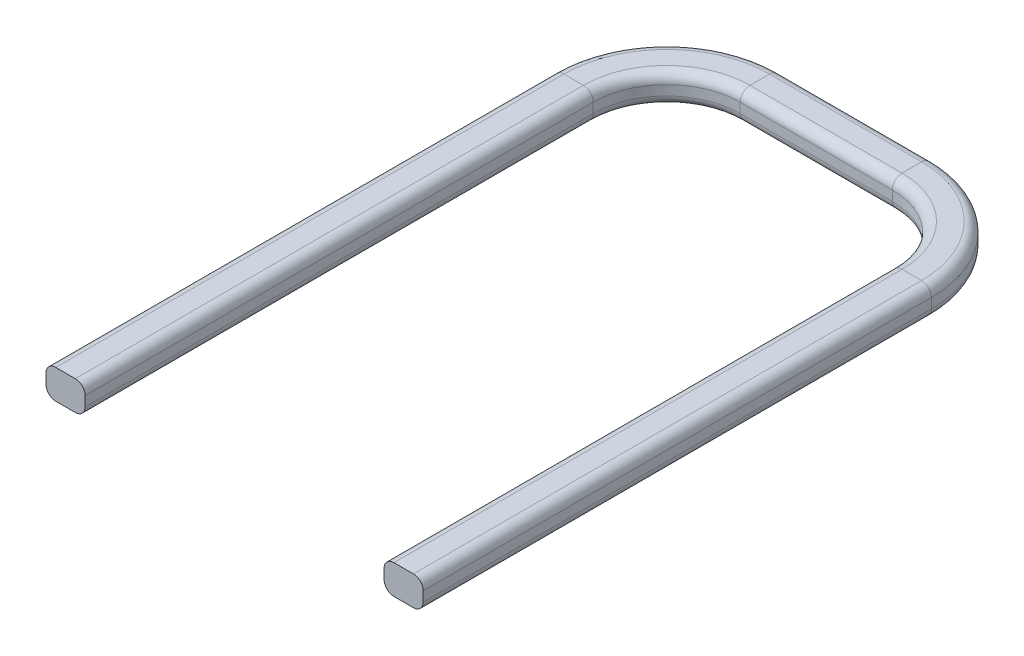
ISO-10303-21;
HEADER;
FILE_DESCRIPTION(('STEP AP214'),'2;1');
FILE_NAME('part.step','',(''),(''),'','','');
FILE_SCHEMA(('AUTOMOTIVE_DESIGN { 1 0 10303 214 1 1 1 1 }'));
ENDSEC;
DATA;
#1=APPLICATION_CONTEXT('core data for automotive mechanical design processes');
#2=APPLICATION_PROTOCOL_DEFINITION('international standard','automotive_design',2000,#1);
#3=PRODUCT_CONTEXT('',#1,'mechanical');
#4=PRODUCT('Part','Part','',(#3));
#5=PRODUCT_RELATED_PRODUCT_CATEGORY('part','',(#4));
#6=PRODUCT_DEFINITION_FORMATION('','',#4);
#7=PRODUCT_DEFINITION_CONTEXT('part definition',#1,'design');
#8=PRODUCT_DEFINITION('design','',#6,#7);
#9=PRODUCT_DEFINITION_SHAPE('','',#8);
#10=(LENGTH_UNIT() NAMED_UNIT(*) SI_UNIT(.MILLI.,.METRE.));
#11=(NAMED_UNIT(*) PLANE_ANGLE_UNIT() SI_UNIT($,.RADIAN.));
#12=(NAMED_UNIT(*) SI_UNIT($,.STERADIAN.) SOLID_ANGLE_UNIT());
#13=UNCERTAINTY_MEASURE_WITH_UNIT(LENGTH_MEASURE(1.E-05),#10,'distance_accuracy_value','');
#14=(GEOMETRIC_REPRESENTATION_CONTEXT(3) GLOBAL_UNCERTAINTY_ASSIGNED_CONTEXT((#13)) GLOBAL_UNIT_ASSIGNED_CONTEXT((#10,
#11,#12)) REPRESENTATION_CONTEXT('',''));
#15=CARTESIAN_POINT('',(0.,0.,0.));
#16=DIRECTION('',(0.,0.,1.));
#17=DIRECTION('',(1.,0.,0.));
#18=AXIS2_PLACEMENT_3D('',#15,#16,#17);
#19=CARTESIAN_POINT('',(0.,0.,0.));
#20=DIRECTION('',(0.,0.,1.));
#21=DIRECTION('',(1.,0.,0.));
#22=AXIS2_PLACEMENT_3D('',#19,#20,#21);
#23=PLANE('',#22);
#24=DIRECTION('',(1.,0.,0.));
#25=VECTOR('',#24,1.);
#26=CARTESIAN_POINT('',(-0.5,-0.375,0.));
#27=LINE('',#26,#25);
#28=CARTESIAN_POINT('',(-0.25,-0.375,0.));
#29=VERTEX_POINT('',#28);
#30=CARTESIAN_POINT('',(0.25,-0.375,0.));
#31=VERTEX_POINT('',#30);
#32=EDGE_CURVE('E390',#29,#31,#27,.T.);
#33=ORIENTED_EDGE('',*,*,#32,.T.);
#34=CARTESIAN_POINT('',(0.25,-0.125,0.));
#35=DIRECTION('',(0.,0.,1.));
#36=DIRECTION('',(1.,0.,0.));
#37=AXIS2_PLACEMENT_3D('',#34,#35,#36);
#38=CIRCLE('',#37,0.25);
#39=CARTESIAN_POINT('',(0.5,-0.125,0.));
#40=VERTEX_POINT('',#39);
#41=EDGE_CURVE('E319',#31,#40,#38,.T.);
#42=ORIENTED_EDGE('',*,*,#41,.T.);
#43=DIRECTION('',(0.,1.,0.));
#44=VECTOR('',#43,1.);
#45=CARTESIAN_POINT('',(0.5,0.375,0.));
#46=LINE('',#45,#44);
#47=CARTESIAN_POINT('',(0.5,0.125,0.));
#48=VERTEX_POINT('',#47);
#49=EDGE_CURVE('E382',#40,#48,#46,.T.);
#50=ORIENTED_EDGE('',*,*,#49,.T.);
#51=CARTESIAN_POINT('',(0.25,0.125,0.));
#52=DIRECTION('',(0.,0.,1.));
#53=DIRECTION('',(1.,0.,0.));
#54=AXIS2_PLACEMENT_3D('',#51,#52,#53);
#55=CIRCLE('',#54,0.25);
#56=CARTESIAN_POINT('',(0.25,0.375,0.));
#57=VERTEX_POINT('',#56);
#58=EDGE_CURVE('E314',#48,#57,#55,.T.);
#59=ORIENTED_EDGE('',*,*,#58,.T.);
#60=DIRECTION('',(-1.,0.,0.));
#61=VECTOR('',#60,1.);
#62=CARTESIAN_POINT('',(-0.5,0.375,0.));
#63=LINE('',#62,#61);
#64=CARTESIAN_POINT('',(-0.25,0.375,0.));
#65=VERTEX_POINT('',#64);
#66=EDGE_CURVE('E389',#57,#65,#63,.T.);
#67=ORIENTED_EDGE('',*,*,#66,.T.);
#68=CARTESIAN_POINT('',(-0.25,0.125,0.));
#69=DIRECTION('',(0.,0.,1.));
#70=DIRECTION('',(1.,0.,0.));
#71=AXIS2_PLACEMENT_3D('',#68,#69,#70);
#72=CIRCLE('',#71,0.25);
#73=CARTESIAN_POINT('',(-0.5,0.125,0.));
#74=VERTEX_POINT('',#73);
#75=EDGE_CURVE('E57',#65,#74,#72,.T.);
#76=ORIENTED_EDGE('',*,*,#75,.T.);
#77=DIRECTION('',(0.,-1.,0.));
#78=VECTOR('',#77,1.);
#79=CARTESIAN_POINT('',(-0.5,0.375,0.));
#80=LINE('',#79,#78);
#81=CARTESIAN_POINT('',(-0.5,-0.125,0.));
#82=VERTEX_POINT('',#81);
#83=EDGE_CURVE('E332',#74,#82,#80,.T.);
#84=ORIENTED_EDGE('',*,*,#83,.T.);
#85=CARTESIAN_POINT('',(-0.25,-0.125,0.));
#86=DIRECTION('',(0.,0.,1.));
#87=DIRECTION('',(1.,0.,0.));
#88=AXIS2_PLACEMENT_3D('',#85,#86,#87);
#89=CIRCLE('',#88,0.25);
#90=EDGE_CURVE('E317',#82,#29,#89,.T.);
#91=ORIENTED_EDGE('',*,*,#90,.T.);
#92=EDGE_LOOP('',(#33,#42,#50,#59,#67,#76,#84,#91));
#93=FACE_BOUND('',#92,.T.);
#94=ADVANCED_FACE('F33',(#93),#23,.T.);
#95=CARTESIAN_POINT('',(8.65,0.,0.));
#96=DIRECTION('',(0.,0.,-1.));
#97=DIRECTION('',(-1.,0.,0.));
#98=AXIS2_PLACEMENT_3D('',#95,#96,#97);
#99=PLANE('',#98);
#100=DIRECTION('',(0.,1.,0.));
#101=VECTOR('',#100,1.);
#102=CARTESIAN_POINT('',(8.15,0.375,0.));
#103=LINE('',#102,#101);
#104=CARTESIAN_POINT('',(8.15,-0.125,0.));
#105=VERTEX_POINT('',#104);
#106=CARTESIAN_POINT('',(8.15,0.125,0.));
#107=VERTEX_POINT('',#106);
#108=EDGE_CURVE('E410',#105,#107,#103,.T.);
#109=ORIENTED_EDGE('',*,*,#108,.F.);
#110=CARTESIAN_POINT('',(8.4,-0.125,0.));
#111=DIRECTION('',(0.,0.,-1.));
#112=DIRECTION('',(-1.,0.,0.));
#113=AXIS2_PLACEMENT_3D('',#110,#111,#112);
#114=CIRCLE('',#113,0.25);
#115=CARTESIAN_POINT('',(8.4,-0.375,0.));
#116=VERTEX_POINT('',#115);
#117=EDGE_CURVE('E235',#105,#116,#114,.F.);
#118=ORIENTED_EDGE('',*,*,#117,.T.);
#119=DIRECTION('',(-1.,0.,0.));
#120=VECTOR('',#119,1.);
#121=CARTESIAN_POINT('',(9.15,-0.375,0.));
#122=LINE('',#121,#120);
#123=CARTESIAN_POINT('',(8.9,-0.375,0.));
#124=VERTEX_POINT('',#123);
#125=EDGE_CURVE('E397',#124,#116,#122,.T.);
#126=ORIENTED_EDGE('',*,*,#125,.F.);
#127=CARTESIAN_POINT('',(8.9,-0.125,0.));
#128=DIRECTION('',(0.,0.,-1.));
#129=DIRECTION('',(-1.,0.,0.));
#130=AXIS2_PLACEMENT_3D('',#127,#128,#129);
#131=CIRCLE('',#130,0.25);
#132=CARTESIAN_POINT('',(9.15,-0.125,0.));
#133=VERTEX_POINT('',#132);
#134=EDGE_CURVE('E245',#124,#133,#131,.F.);
#135=ORIENTED_EDGE('',*,*,#134,.T.);
#136=DIRECTION('',(0.,-1.,0.));
#137=VECTOR('',#136,1.);
#138=CARTESIAN_POINT('',(9.15,0.375,0.));
#139=LINE('',#138,#137);
#140=CARTESIAN_POINT('',(9.15,0.125,0.));
#141=VERTEX_POINT('',#140);
#142=EDGE_CURVE('E422',#141,#133,#139,.T.);
#143=ORIENTED_EDGE('',*,*,#142,.F.);
#144=CARTESIAN_POINT('',(8.9,0.125,0.));
#145=DIRECTION('',(0.,0.,-1.));
#146=DIRECTION('',(-1.,0.,0.));
#147=AXIS2_PLACEMENT_3D('',#144,#145,#146);
#148=CIRCLE('',#147,0.25);
#149=CARTESIAN_POINT('',(8.9,0.375,0.));
#150=VERTEX_POINT('',#149);
#151=EDGE_CURVE('E238',#141,#150,#148,.F.);
#152=ORIENTED_EDGE('',*,*,#151,.T.);
#153=DIRECTION('',(1.,0.,0.));
#154=VECTOR('',#153,1.);
#155=CARTESIAN_POINT('',(9.15,0.375,0.));
#156=LINE('',#155,#154);
#157=CARTESIAN_POINT('',(8.4,0.375,0.));
#158=VERTEX_POINT('',#157);
#159=EDGE_CURVE('E240',#158,#150,#156,.T.);
#160=ORIENTED_EDGE('',*,*,#159,.F.);
#161=CARTESIAN_POINT('',(8.4,0.125,0.));
#162=DIRECTION('',(0.,0.,-1.));
#163=DIRECTION('',(-1.,0.,0.));
#164=AXIS2_PLACEMENT_3D('',#161,#162,#163);
#165=CIRCLE('',#164,0.25);
#166=EDGE_CURVE('E236',#158,#107,#165,.F.);
#167=ORIENTED_EDGE('',*,*,#166,.T.);
#168=EDGE_LOOP('',(#109,#118,#126,#135,#143,#152,#160,#167));
#169=FACE_BOUND('',#168,.T.);
#170=ADVANCED_FACE('F507',(#169),#99,.F.);
#171=CARTESIAN_POINT('',(-0.5,0.375,0.));
#172=DIRECTION('',(1.,0.,0.));
#173=DIRECTION('',(0.,1.,0.));
#174=AXIS2_PLACEMENT_3D('',#171,#172,#173);
#175=PLANE('',#174);
#176=DIRECTION('',(0.,-1.,0.));
#177=VECTOR('',#176,1.);
#178=CARTESIAN_POINT('',(-0.5,0.375,-13.));
#179=LINE('',#178,#177);
#180=CARTESIAN_POINT('',(-0.5,0.125,-13.));
#181=VERTEX_POINT('',#180);
#182=CARTESIAN_POINT('',(-0.5,-0.125,-13.));
#183=VERTEX_POINT('',#182);
#184=EDGE_CURVE('E392',#181,#183,#179,.T.);
#185=ORIENTED_EDGE('',*,*,#184,.T.);
#186=DIRECTION('',(0.,0.,-1.));
#187=VECTOR('',#186,1.);
#188=CARTESIAN_POINT('',(-0.5,-0.125,0.));
#189=LINE('',#188,#187);
#190=EDGE_CURVE('E50',#183,#82,#189,.F.);
#191=ORIENTED_EDGE('',*,*,#190,.T.);
#192=ORIENTED_EDGE('',*,*,#83,.F.);
#193=DIRECTION('',(0.,0.,-1.));
#194=VECTOR('',#193,1.);
#195=CARTESIAN_POINT('',(-0.5,0.125,0.));
#196=LINE('',#195,#194);
#197=EDGE_CURVE('E321',#74,#181,#196,.T.);
#198=ORIENTED_EDGE('',*,*,#197,.T.);
#199=EDGE_LOOP('',(#185,#191,#192,#198));
#200=FACE_BOUND('',#199,.T.);
#201=ADVANCED_FACE('F467',(#200),#175,.F.);
#202=CARTESIAN_POINT('',(-0.5,-0.375,0.));
#203=DIRECTION('',(0.,1.,0.));
#204=DIRECTION('',(0.,0.,1.));
#205=AXIS2_PLACEMENT_3D('',#202,#203,#204);
#206=PLANE('',#205);
#207=DIRECTION('',(1.,0.,0.));
#208=VECTOR('',#207,1.);
#209=CARTESIAN_POINT('',(-0.5,-0.375,-13.));
#210=LINE('',#209,#208);
#211=CARTESIAN_POINT('',(-0.25,-0.375,-13.));
#212=VERTEX_POINT('',#211);
#213=CARTESIAN_POINT('',(0.25,-0.375,-13.));
#214=VERTEX_POINT('',#213);
#215=EDGE_CURVE('E401',#212,#214,#210,.T.);
#216=ORIENTED_EDGE('',*,*,#215,.T.);
#217=DIRECTION('',(0.,0.,-1.));
#218=VECTOR('',#217,1.);
#219=CARTESIAN_POINT('',(0.25,-0.375,0.));
#220=LINE('',#219,#218);
#221=EDGE_CURVE('E312',#214,#31,#220,.F.);
#222=ORIENTED_EDGE('',*,*,#221,.T.);
#223=ORIENTED_EDGE('',*,*,#32,.F.);
#224=DIRECTION('',(0.,0.,-1.));
#225=VECTOR('',#224,1.);
#226=CARTESIAN_POINT('',(-0.25,-0.375,0.));
#227=LINE('',#226,#225);
#228=EDGE_CURVE('E310',#29,#212,#227,.T.);
#229=ORIENTED_EDGE('',*,*,#228,.T.);
#230=EDGE_LOOP('',(#216,#222,#223,#229));
#231=FACE_BOUND('',#230,.T.);
#232=ADVANCED_FACE('F532',(#231),#206,.F.);
#233=CARTESIAN_POINT('',(0.5,0.375,0.));
#234=DIRECTION('',(-1.,0.,0.));
#235=DIRECTION('',(0.,-1.,0.));
#236=AXIS2_PLACEMENT_3D('',#233,#234,#235);
#237=PLANE('',#236);
#238=ORIENTED_EDGE('',*,*,#49,.F.);
#239=DIRECTION('',(0.,0.,-1.));
#240=VECTOR('',#239,1.);
#241=CARTESIAN_POINT('',(0.5,-0.125,0.));
#242=LINE('',#241,#240);
#243=CARTESIAN_POINT('',(0.5,-0.125,-13.));
#244=VERTEX_POINT('',#243);
#245=EDGE_CURVE('E308',#40,#244,#242,.T.);
#246=ORIENTED_EDGE('',*,*,#245,.T.);
#247=DIRECTION('',(0.,1.,0.));
#248=VECTOR('',#247,1.);
#249=CARTESIAN_POINT('',(0.5,0.375,-13.));
#250=LINE('',#249,#248);
#251=CARTESIAN_POINT('',(0.5,0.125,-13.));
#252=VERTEX_POINT('',#251);
#253=EDGE_CURVE('E385',#244,#252,#250,.T.);
#254=ORIENTED_EDGE('',*,*,#253,.T.);
#255=DIRECTION('',(0.,0.,-1.));
#256=VECTOR('',#255,1.);
#257=CARTESIAN_POINT('',(0.5,0.125,0.));
#258=LINE('',#257,#256);
#259=EDGE_CURVE('E306',#252,#48,#258,.F.);
#260=ORIENTED_EDGE('',*,*,#259,.T.);
#261=EDGE_LOOP('',(#238,#246,#254,#260));
#262=FACE_BOUND('',#261,.T.);
#263=ADVANCED_FACE('F381',(#262),#237,.F.);
#264=CARTESIAN_POINT('',(-0.5,0.375,0.));
#265=DIRECTION('',(0.,-1.,0.));
#266=DIRECTION('',(0.,0.,-1.));
#267=AXIS2_PLACEMENT_3D('',#264,#265,#266);
#268=PLANE('',#267);
#269=DIRECTION('',(-1.,0.,0.));
#270=VECTOR('',#269,1.);
#271=CARTESIAN_POINT('',(-0.5,0.375,-13.));
#272=LINE('',#271,#270);
#273=CARTESIAN_POINT('',(0.25,0.375,-13.));
#274=VERTEX_POINT('',#273);
#275=CARTESIAN_POINT('',(-0.25,0.375,-13.));
#276=VERTEX_POINT('',#275);
#277=EDGE_CURVE('E400',#274,#276,#272,.T.);
#278=ORIENTED_EDGE('',*,*,#277,.T.);
#279=DIRECTION('',(0.,0.,-1.));
#280=VECTOR('',#279,1.);
#281=CARTESIAN_POINT('',(-0.25,0.375,0.));
#282=LINE('',#281,#280);
#283=EDGE_CURVE('E11',#276,#65,#282,.F.);
#284=ORIENTED_EDGE('',*,*,#283,.T.);
#285=ORIENTED_EDGE('',*,*,#66,.F.);
#286=DIRECTION('',(0.,0.,-1.));
#287=VECTOR('',#286,1.);
#288=CARTESIAN_POINT('',(0.25,0.375,0.));
#289=LINE('',#288,#287);
#290=EDGE_CURVE('E42',#57,#274,#289,.T.);
#291=ORIENTED_EDGE('',*,*,#290,.T.);
#292=EDGE_LOOP('',(#278,#284,#285,#291));
#293=FACE_BOUND('',#292,.T.);
#294=ADVANCED_FACE('F462',(#293),#268,.F.);
#295=CARTESIAN_POINT('',(2.38,0.,-13.));
#296=DIRECTION('',(0.,-1.,0.));
#297=DIRECTION('',(0.,0.,-1.));
#298=AXIS2_PLACEMENT_3D('',#295,#296,#297);
#299=CYLINDRICAL_SURFACE('',#298,2.88);
#300=DIRECTION('',(0.,-1.,0.));
#301=VECTOR('',#300,1.);
#302=CARTESIAN_POINT('',(2.38,0.375,-15.88));
#303=LINE('',#302,#301);
#304=CARTESIAN_POINT('',(2.38,0.125,-15.88));
#305=VERTEX_POINT('',#304);
#306=CARTESIAN_POINT('',(2.38,-0.125,-15.88));
#307=VERTEX_POINT('',#306);
#308=EDGE_CURVE('E414',#305,#307,#303,.T.);
#309=ORIENTED_EDGE('',*,*,#308,.T.);
#310=CARTESIAN_POINT('',(2.38,-0.125,-13.));
#311=DIRECTION('',(0.,1.,0.));
#312=DIRECTION('',(0.,0.,1.));
#313=AXIS2_PLACEMENT_3D('',#310,#311,#312);
#314=CIRCLE('',#313,2.88);
#315=EDGE_CURVE('E287',#307,#183,#314,.T.);
#316=ORIENTED_EDGE('',*,*,#315,.T.);
#317=ORIENTED_EDGE('',*,*,#184,.F.);
#318=CARTESIAN_POINT('',(2.38,0.125,-13.));
#319=DIRECTION('',(0.,-1.,0.));
#320=DIRECTION('',(0.,0.,-1.));
#321=AXIS2_PLACEMENT_3D('',#318,#319,#320);
#322=CIRCLE('',#321,2.88);
#323=EDGE_CURVE('E285',#181,#305,#322,.T.);
#324=ORIENTED_EDGE('',*,*,#323,.T.);
#325=EDGE_LOOP('',(#309,#316,#317,#324));
#326=FACE_BOUND('',#325,.T.);
#327=ADVANCED_FACE('F470',(#326),#299,.T.);
#328=CARTESIAN_POINT('',(-0.5,-0.375,-13.));
#329=DIRECTION('',(0.,1.,0.));
#330=DIRECTION('',(0.,0.,1.));
#331=AXIS2_PLACEMENT_3D('',#328,#329,#330);
#332=PLANE('',#331);
#333=DIRECTION('',(0.,0.,1.));
#334=VECTOR('',#333,1.);
#335=CARTESIAN_POINT('',(2.38,-0.375,-15.88));
#336=LINE('',#335,#334);
#337=CARTESIAN_POINT('',(2.38,-0.375,-15.63));
#338=VERTEX_POINT('',#337);
#339=CARTESIAN_POINT('',(2.38,-0.375,-15.13));
#340=VERTEX_POINT('',#339);
#341=EDGE_CURVE('E406',#338,#340,#336,.T.);
#342=ORIENTED_EDGE('',*,*,#341,.T.);
#343=CARTESIAN_POINT('',(2.38,-0.375,-13.));
#344=DIRECTION('',(0.,1.,0.));
#345=DIRECTION('',(0.,0.,1.));
#346=AXIS2_PLACEMENT_3D('',#343,#344,#345);
#347=CIRCLE('',#346,2.13);
#348=EDGE_CURVE('E270',#340,#214,#347,.T.);
#349=ORIENTED_EDGE('',*,*,#348,.T.);
#350=ORIENTED_EDGE('',*,*,#215,.F.);
#351=CARTESIAN_POINT('',(2.38,-0.375,-13.));
#352=DIRECTION('',(0.,1.,0.));
#353=DIRECTION('',(0.,0.,1.));
#354=AXIS2_PLACEMENT_3D('',#351,#352,#353);
#355=CIRCLE('',#354,2.63);
#356=EDGE_CURVE('E268',#212,#338,#355,.F.);
#357=ORIENTED_EDGE('',*,*,#356,.T.);
#358=EDGE_LOOP('',(#342,#349,#350,#357));
#359=FACE_BOUND('',#358,.T.);
#360=ADVANCED_FACE('F811',(#359),#332,.F.);
#361=CARTESIAN_POINT('',(2.38,0.,-13.));
#362=DIRECTION('',(0.,-1.,0.));
#363=DIRECTION('',(0.,0.,-1.));
#364=AXIS2_PLACEMENT_3D('',#361,#362,#363);
#365=CYLINDRICAL_SURFACE('',#364,1.88);
#366=ORIENTED_EDGE('',*,*,#253,.F.);
#367=CARTESIAN_POINT('',(2.38,-0.125,-13.));
#368=DIRECTION('',(0.,1.,0.));
#369=DIRECTION('',(0.,0.,1.));
#370=AXIS2_PLACEMENT_3D('',#367,#368,#369);
#371=CIRCLE('',#370,1.88);
#372=CARTESIAN_POINT('',(2.38,-0.125,-14.88));
#373=VERTEX_POINT('',#372);
#374=EDGE_CURVE('E266',#244,#373,#371,.F.);
#375=ORIENTED_EDGE('',*,*,#374,.T.);
#376=DIRECTION('',(0.,1.,0.));
#377=VECTOR('',#376,1.);
#378=CARTESIAN_POINT('',(2.38,0.375,-14.88));
#379=LINE('',#378,#377);
#380=CARTESIAN_POINT('',(2.38,0.125,-14.88));
#381=VERTEX_POINT('',#380);
#382=EDGE_CURVE('E402',#373,#381,#379,.T.);
#383=ORIENTED_EDGE('',*,*,#382,.T.);
#384=CARTESIAN_POINT('',(2.38,0.125,-13.));
#385=DIRECTION('',(0.,-1.,0.));
#386=DIRECTION('',(0.,0.,-1.));
#387=AXIS2_PLACEMENT_3D('',#384,#385,#386);
#388=CIRCLE('',#387,1.88);
#389=EDGE_CURVE('E264',#381,#252,#388,.F.);
#390=ORIENTED_EDGE('',*,*,#389,.T.);
#391=EDGE_LOOP('',(#366,#375,#383,#390));
#392=FACE_BOUND('',#391,.T.);
#393=ADVANCED_FACE('F546',(#392),#365,.F.);
#394=CARTESIAN_POINT('',(-0.5,0.375,-13.));
#395=DIRECTION('',(0.,-1.,0.));
#396=DIRECTION('',(0.,0.,-1.));
#397=AXIS2_PLACEMENT_3D('',#394,#395,#396);
#398=PLANE('',#397);
#399=DIRECTION('',(0.,0.,-1.));
#400=VECTOR('',#399,1.);
#401=CARTESIAN_POINT('',(2.38,0.375,-15.88));
#402=LINE('',#401,#400);
#403=CARTESIAN_POINT('',(2.38,0.375,-15.13));
#404=VERTEX_POINT('',#403);
#405=CARTESIAN_POINT('',(2.38,0.375,-15.63));
#406=VERTEX_POINT('',#405);
#407=EDGE_CURVE('E405',#404,#406,#402,.T.);
#408=ORIENTED_EDGE('',*,*,#407,.T.);
#409=CARTESIAN_POINT('',(2.38,0.375,-13.));
#410=DIRECTION('',(0.,-1.,0.));
#411=DIRECTION('',(0.,0.,-1.));
#412=AXIS2_PLACEMENT_3D('',#409,#410,#411);
#413=CIRCLE('',#412,2.63);
#414=EDGE_CURVE('E304',#406,#276,#413,.F.);
#415=ORIENTED_EDGE('',*,*,#414,.T.);
#416=ORIENTED_EDGE('',*,*,#277,.F.);
#417=CARTESIAN_POINT('',(2.38,0.375,-13.));
#418=DIRECTION('',(0.,-1.,0.));
#419=DIRECTION('',(0.,0.,-1.));
#420=AXIS2_PLACEMENT_3D('',#417,#418,#419);
#421=CIRCLE('',#420,2.13);
#422=EDGE_CURVE('E302',#274,#404,#421,.T.);
#423=ORIENTED_EDGE('',*,*,#422,.T.);
#424=EDGE_LOOP('',(#408,#415,#416,#423));
#425=FACE_BOUND('',#424,.T.);
#426=ADVANCED_FACE('F459',(#425),#398,.F.);
#427=CARTESIAN_POINT('',(2.38,0.375,-15.88));
#428=DIRECTION('',(0.,0.,1.));
#429=DIRECTION('',(0.,-1.,0.));
#430=AXIS2_PLACEMENT_3D('',#427,#428,#429);
#431=PLANE('',#430);
#432=DIRECTION('',(0.,-1.,0.));
#433=VECTOR('',#432,1.);
#434=CARTESIAN_POINT('',(6.26999999999998,0.375,-15.88));
#435=LINE('',#434,#433);
#436=CARTESIAN_POINT('',(6.26999999999998,0.125,-15.88));
#437=VERTEX_POINT('',#436);
#438=CARTESIAN_POINT('',(6.26999999999998,-0.125,-15.88));
#439=VERTEX_POINT('',#438);
#440=EDGE_CURVE('E417',#437,#439,#435,.T.);
#441=ORIENTED_EDGE('',*,*,#440,.T.);
#442=DIRECTION('',(1.,0.,0.));
#443=VECTOR('',#442,1.);
#444=CARTESIAN_POINT('',(2.38,-0.125,-15.88));
#445=LINE('',#444,#443);
#446=EDGE_CURVE('E283',#439,#307,#445,.F.);
#447=ORIENTED_EDGE('',*,*,#446,.T.);
#448=ORIENTED_EDGE('',*,*,#308,.F.);
#449=DIRECTION('',(1.,0.,0.));
#450=VECTOR('',#449,1.);
#451=CARTESIAN_POINT('',(2.38,0.125,-15.88));
#452=LINE('',#451,#450);
#453=EDGE_CURVE('E281',#305,#437,#452,.T.);
#454=ORIENTED_EDGE('',*,*,#453,.T.);
#455=EDGE_LOOP('',(#441,#447,#448,#454));
#456=FACE_BOUND('',#455,.T.);
#457=ADVANCED_FACE('F516',(#456),#431,.F.);
#458=CARTESIAN_POINT('',(2.38,-0.375,-15.88));
#459=DIRECTION('',(0.,1.,0.));
#460=DIRECTION('',(0.,0.,1.));
#461=AXIS2_PLACEMENT_3D('',#458,#459,#460);
#462=PLANE('',#461);
#463=DIRECTION('',(0.,0.,1.));
#464=VECTOR('',#463,1.);
#465=CARTESIAN_POINT('',(6.26999999999998,-0.375,-15.88));
#466=LINE('',#465,#464);
#467=CARTESIAN_POINT('',(6.26999999999998,-0.375,-15.63));
#468=VERTEX_POINT('',#467);
#469=CARTESIAN_POINT('',(6.26999999999998,-0.375,-15.13));
#470=VERTEX_POINT('',#469);
#471=EDGE_CURVE('E408',#468,#470,#466,.T.);
#472=ORIENTED_EDGE('',*,*,#471,.T.);
#473=DIRECTION('',(1.,0.,0.));
#474=VECTOR('',#473,1.);
#475=CARTESIAN_POINT('',(2.38,-0.375,-15.13));
#476=LINE('',#475,#474);
#477=EDGE_CURVE('E262',#470,#340,#476,.F.);
#478=ORIENTED_EDGE('',*,*,#477,.T.);
#479=ORIENTED_EDGE('',*,*,#341,.F.);
#480=DIRECTION('',(1.,0.,0.));
#481=VECTOR('',#480,1.);
#482=CARTESIAN_POINT('',(2.38,-0.375,-15.63));
#483=LINE('',#482,#481);
#484=EDGE_CURVE('E260',#338,#468,#483,.T.);
#485=ORIENTED_EDGE('',*,*,#484,.T.);
#486=EDGE_LOOP('',(#472,#478,#479,#485));
#487=FACE_BOUND('',#486,.T.);
#488=ADVANCED_FACE('F781',(#487),#462,.F.);
#489=CARTESIAN_POINT('',(2.38,0.375,-14.88));
#490=DIRECTION('',(0.,0.,-1.));
#491=DIRECTION('',(0.,1.,0.));
#492=AXIS2_PLACEMENT_3D('',#489,#490,#491);
#493=PLANE('',#492);
#494=ORIENTED_EDGE('',*,*,#382,.F.);
#495=DIRECTION('',(1.,0.,0.));
#496=VECTOR('',#495,1.);
#497=CARTESIAN_POINT('',(2.38,-0.125,-14.88));
#498=LINE('',#497,#496);
#499=CARTESIAN_POINT('',(6.26999999999998,-0.125,-14.88));
#500=VERTEX_POINT('',#499);
#501=EDGE_CURVE('E258',#373,#500,#498,.T.);
#502=ORIENTED_EDGE('',*,*,#501,.T.);
#503=DIRECTION('',(0.,1.,0.));
#504=VECTOR('',#503,1.);
#505=CARTESIAN_POINT('',(6.26999999999998,0.375,-14.88));
#506=LINE('',#505,#504);
#507=CARTESIAN_POINT('',(6.26999999999998,0.125,-14.88));
#508=VERTEX_POINT('',#507);
#509=EDGE_CURVE('E204',#500,#508,#506,.T.);
#510=ORIENTED_EDGE('',*,*,#509,.T.);
#511=DIRECTION('',(1.,0.,0.));
#512=VECTOR('',#511,1.);
#513=CARTESIAN_POINT('',(2.38,0.125,-14.88));
#514=LINE('',#513,#512);
#515=EDGE_CURVE('E256',#508,#381,#514,.F.);
#516=ORIENTED_EDGE('',*,*,#515,.T.);
#517=EDGE_LOOP('',(#494,#502,#510,#516));
#518=FACE_BOUND('',#517,.T.);
#519=ADVANCED_FACE('F548',(#518),#493,.F.);
#520=CARTESIAN_POINT('',(2.38,0.375,-15.88));
#521=DIRECTION('',(0.,-1.,0.));
#522=DIRECTION('',(0.,0.,-1.));
#523=AXIS2_PLACEMENT_3D('',#520,#521,#522);
#524=PLANE('',#523);
#525=DIRECTION('',(0.,0.,-1.));
#526=VECTOR('',#525,1.);
#527=CARTESIAN_POINT('',(6.26999999999998,0.375,-15.88));
#528=LINE('',#527,#526);
#529=CARTESIAN_POINT('',(6.26999999999998,0.375,-15.13));
#530=VERTEX_POINT('',#529);
#531=CARTESIAN_POINT('',(6.26999999999998,0.375,-15.63));
#532=VERTEX_POINT('',#531);
#533=EDGE_CURVE('E407',#530,#532,#528,.T.);
#534=ORIENTED_EDGE('',*,*,#533,.T.);
#535=DIRECTION('',(1.,0.,0.));
#536=VECTOR('',#535,1.);
#537=CARTESIAN_POINT('',(2.38,0.375,-15.63));
#538=LINE('',#537,#536);
#539=EDGE_CURVE('E300',#532,#406,#538,.F.);
#540=ORIENTED_EDGE('',*,*,#539,.T.);
#541=ORIENTED_EDGE('',*,*,#407,.F.);
#542=DIRECTION('',(1.,0.,0.));
#543=VECTOR('',#542,1.);
#544=CARTESIAN_POINT('',(2.38,0.375,-15.13));
#545=LINE('',#544,#543);
#546=EDGE_CURVE('E298',#404,#530,#545,.T.);
#547=ORIENTED_EDGE('',*,*,#546,.T.);
#548=EDGE_LOOP('',(#534,#540,#541,#547));
#549=FACE_BOUND('',#548,.T.);
#550=ADVANCED_FACE('F446',(#549),#524,.F.);
#551=CARTESIAN_POINT('',(6.27,0.,-13.));
#552=DIRECTION('',(0.,-1.,0.));
#553=DIRECTION('',(0.,0.,-1.));
#554=AXIS2_PLACEMENT_3D('',#551,#552,#553);
#555=CYLINDRICAL_SURFACE('',#554,2.88);
#556=DIRECTION('',(0.,-1.,0.));
#557=VECTOR('',#556,1.);
#558=CARTESIAN_POINT('',(9.15,0.375,-13.));
#559=LINE('',#558,#557);
#560=CARTESIAN_POINT('',(9.15,0.125,-13.));
#561=VERTEX_POINT('',#560);
#562=CARTESIAN_POINT('',(9.15,-0.125,-13.));
#563=VERTEX_POINT('',#562);
#564=EDGE_CURVE('E420',#561,#563,#559,.T.);
#565=ORIENTED_EDGE('',*,*,#564,.T.);
#566=CARTESIAN_POINT('',(6.27,-0.125,-13.));
#567=DIRECTION('',(0.,1.,0.));
#568=DIRECTION('',(0.,0.,1.));
#569=AXIS2_PLACEMENT_3D('',#566,#567,#568);
#570=CIRCLE('',#569,2.88);
#571=EDGE_CURVE('E279',#563,#439,#570,.T.);
#572=ORIENTED_EDGE('',*,*,#571,.T.);
#573=ORIENTED_EDGE('',*,*,#440,.F.);
#574=CARTESIAN_POINT('',(6.27,0.125,-13.));
#575=DIRECTION('',(0.,-1.,0.));
#576=DIRECTION('',(0.,0.,-1.));
#577=AXIS2_PLACEMENT_3D('',#574,#575,#576);
#578=CIRCLE('',#577,2.88);
#579=EDGE_CURVE('E277',#437,#561,#578,.T.);
#580=ORIENTED_EDGE('',*,*,#579,.T.);
#581=EDGE_LOOP('',(#565,#572,#573,#580));
#582=FACE_BOUND('',#581,.T.);
#583=ADVANCED_FACE('F512',(#582),#555,.T.);
#584=CARTESIAN_POINT('',(6.26999999999998,-0.375,-15.88));
#585=DIRECTION('',(0.,1.,0.));
#586=DIRECTION('',(0.,0.,1.));
#587=AXIS2_PLACEMENT_3D('',#584,#585,#586);
#588=PLANE('',#587);
#589=DIRECTION('',(-1.,0.,0.));
#590=VECTOR('',#589,1.);
#591=CARTESIAN_POINT('',(9.15,-0.375,-13.));
#592=LINE('',#591,#590);
#593=CARTESIAN_POINT('',(8.9,-0.375,-13.));
#594=VERTEX_POINT('',#593);
#595=CARTESIAN_POINT('',(8.4,-0.375,-13.));
#596=VERTEX_POINT('',#595);
#597=EDGE_CURVE('E222',#594,#596,#592,.T.);
#598=ORIENTED_EDGE('',*,*,#597,.T.);
#599=CARTESIAN_POINT('',(6.27,-0.375,-13.));
#600=DIRECTION('',(0.,1.,0.));
#601=DIRECTION('',(0.,0.,1.));
#602=AXIS2_PLACEMENT_3D('',#599,#600,#601);
#603=CIRCLE('',#602,2.13);
#604=EDGE_CURVE('E228',#596,#470,#603,.T.);
#605=ORIENTED_EDGE('',*,*,#604,.T.);
#606=ORIENTED_EDGE('',*,*,#471,.F.);
#607=CARTESIAN_POINT('',(6.27,-0.375,-13.));
#608=DIRECTION('',(0.,1.,0.));
#609=DIRECTION('',(0.,0.,1.));
#610=AXIS2_PLACEMENT_3D('',#607,#608,#609);
#611=CIRCLE('',#610,2.63);
#612=EDGE_CURVE('E209',#468,#594,#611,.F.);
#613=ORIENTED_EDGE('',*,*,#612,.T.);
#614=EDGE_LOOP('',(#598,#605,#606,#613));
#615=FACE_BOUND('',#614,.T.);
#616=ADVANCED_FACE('F491',(#615),#588,.F.);
#617=CARTESIAN_POINT('',(6.27,0.,-13.));
#618=DIRECTION('',(0.,-1.,0.));
#619=DIRECTION('',(0.,0.,-1.));
#620=AXIS2_PLACEMENT_3D('',#617,#618,#619);
#621=CYLINDRICAL_SURFACE('',#620,1.88);
#622=ORIENTED_EDGE('',*,*,#509,.F.);
#623=CARTESIAN_POINT('',(6.27,-0.125,-13.));
#624=DIRECTION('',(0.,1.,0.));
#625=DIRECTION('',(0.,0.,1.));
#626=AXIS2_PLACEMENT_3D('',#623,#624,#625);
#627=CIRCLE('',#626,1.88);
#628=CARTESIAN_POINT('',(8.15,-0.125,-13.));
#629=VERTEX_POINT('',#628);
#630=EDGE_CURVE('E198',#500,#629,#627,.F.);
#631=ORIENTED_EDGE('',*,*,#630,.T.);
#632=DIRECTION('',(0.,1.,0.));
#633=VECTOR('',#632,1.);
#634=CARTESIAN_POINT('',(8.15,0.375,-13.));
#635=LINE('',#634,#633);
#636=CARTESIAN_POINT('',(8.15,0.125,-13.));
#637=VERTEX_POINT('',#636);
#638=EDGE_CURVE('E201',#629,#637,#635,.T.);
#639=ORIENTED_EDGE('',*,*,#638,.T.);
#640=CARTESIAN_POINT('',(6.27,0.125,-13.));
#641=DIRECTION('',(0.,-1.,0.));
#642=DIRECTION('',(0.,0.,-1.));
#643=AXIS2_PLACEMENT_3D('',#640,#641,#642);
#644=CIRCLE('',#643,1.88);
#645=EDGE_CURVE('E210',#637,#508,#644,.F.);
#646=ORIENTED_EDGE('',*,*,#645,.T.);
#647=EDGE_LOOP('',(#622,#631,#639,#646));
#648=FACE_BOUND('',#647,.T.);
#649=ADVANCED_FACE('F200',(#648),#621,.F.);
#650=CARTESIAN_POINT('',(6.26999999999998,0.375,-15.88));
#651=DIRECTION('',(0.,-1.,0.));
#652=DIRECTION('',(0.,0.,-1.));
#653=AXIS2_PLACEMENT_3D('',#650,#651,#652);
#654=PLANE('',#653);
#655=DIRECTION('',(1.,0.,0.));
#656=VECTOR('',#655,1.);
#657=CARTESIAN_POINT('',(9.15,0.375,-13.));
#658=LINE('',#657,#656);
#659=CARTESIAN_POINT('',(8.4,0.375,-13.));
#660=VERTEX_POINT('',#659);
#661=CARTESIAN_POINT('',(8.9,0.375,-13.));
#662=VERTEX_POINT('',#661);
#663=EDGE_CURVE('E221',#660,#662,#658,.T.);
#664=ORIENTED_EDGE('',*,*,#663,.T.);
#665=CARTESIAN_POINT('',(6.27,0.375,-13.));
#666=DIRECTION('',(0.,-1.,0.));
#667=DIRECTION('',(0.,0.,-1.));
#668=AXIS2_PLACEMENT_3D('',#665,#666,#667);
#669=CIRCLE('',#668,2.63);
#670=EDGE_CURVE('E296',#662,#532,#669,.F.);
#671=ORIENTED_EDGE('',*,*,#670,.T.);
#672=ORIENTED_EDGE('',*,*,#533,.F.);
#673=CARTESIAN_POINT('',(6.27,0.375,-13.));
#674=DIRECTION('',(0.,-1.,0.));
#675=DIRECTION('',(0.,0.,-1.));
#676=AXIS2_PLACEMENT_3D('',#673,#674,#675);
#677=CIRCLE('',#676,2.13);
#678=EDGE_CURVE('E294',#530,#660,#677,.T.);
#679=ORIENTED_EDGE('',*,*,#678,.T.);
#680=EDGE_LOOP('',(#664,#671,#672,#679));
#681=FACE_BOUND('',#680,.T.);
#682=ADVANCED_FACE('F442',(#681),#654,.F.);
#683=CARTESIAN_POINT('',(9.15,0.375,-13.));
#684=DIRECTION('',(-1.,0.,0.));
#685=DIRECTION('',(0.,-1.,0.));
#686=AXIS2_PLACEMENT_3D('',#683,#684,#685);
#687=PLANE('',#686);
#688=ORIENTED_EDGE('',*,*,#142,.T.);
#689=DIRECTION('',(0.,0.,1.));
#690=VECTOR('',#689,1.);
#691=CARTESIAN_POINT('',(9.15,-0.125,-13.));
#692=LINE('',#691,#690);
#693=EDGE_CURVE('E275',#133,#563,#692,.F.);
#694=ORIENTED_EDGE('',*,*,#693,.T.);
#695=ORIENTED_EDGE('',*,*,#564,.F.);
#696=DIRECTION('',(0.,0.,1.));
#697=VECTOR('',#696,1.);
#698=CARTESIAN_POINT('',(9.15,0.125,-13.));
#699=LINE('',#698,#697);
#700=EDGE_CURVE('E272',#561,#141,#699,.T.);
#701=ORIENTED_EDGE('',*,*,#700,.T.);
#702=EDGE_LOOP('',(#688,#694,#695,#701));
#703=FACE_BOUND('',#702,.T.);
#704=ADVANCED_FACE('F509',(#703),#687,.F.);
#705=CARTESIAN_POINT('',(9.15,-0.375,-13.));
#706=DIRECTION('',(0.,1.,0.));
#707=DIRECTION('',(0.,0.,1.));
#708=AXIS2_PLACEMENT_3D('',#705,#706,#707);
#709=PLANE('',#708);
#710=ORIENTED_EDGE('',*,*,#125,.T.);
#711=DIRECTION('',(0.,0.,1.));
#712=VECTOR('',#711,1.);
#713=CARTESIAN_POINT('',(8.4,-0.375,-13.));
#714=LINE('',#713,#712);
#715=EDGE_CURVE('E251',#116,#596,#714,.F.);
#716=ORIENTED_EDGE('',*,*,#715,.T.);
#717=ORIENTED_EDGE('',*,*,#597,.F.);
#718=DIRECTION('',(0.,0.,1.));
#719=VECTOR('',#718,1.);
#720=CARTESIAN_POINT('',(8.9,-0.375,-13.));
#721=LINE('',#720,#719);
#722=EDGE_CURVE('E248',#594,#124,#721,.T.);
#723=ORIENTED_EDGE('',*,*,#722,.T.);
#724=EDGE_LOOP('',(#710,#716,#717,#723));
#725=FACE_BOUND('',#724,.T.);
#726=ADVANCED_FACE('F497',(#725),#709,.F.);
#727=CARTESIAN_POINT('',(8.15,0.375,-13.));
#728=DIRECTION('',(1.,0.,0.));
#729=DIRECTION('',(0.,1.,0.));
#730=AXIS2_PLACEMENT_3D('',#727,#728,#729);
#731=PLANE('',#730);
#732=ORIENTED_EDGE('',*,*,#638,.F.);
#733=DIRECTION('',(0.,0.,1.));
#734=VECTOR('',#733,1.);
#735=CARTESIAN_POINT('',(8.15,-0.125,-13.));
#736=LINE('',#735,#734);
#737=EDGE_CURVE('E217',#629,#105,#736,.T.);
#738=ORIENTED_EDGE('',*,*,#737,.T.);
#739=ORIENTED_EDGE('',*,*,#108,.T.);
#740=DIRECTION('',(0.,0.,1.));
#741=VECTOR('',#740,1.);
#742=CARTESIAN_POINT('',(8.15,0.125,-13.));
#743=LINE('',#742,#741);
#744=EDGE_CURVE('E220',#107,#637,#743,.F.);
#745=ORIENTED_EDGE('',*,*,#744,.T.);
#746=EDGE_LOOP('',(#732,#738,#739,#745));
#747=FACE_BOUND('',#746,.T.);
#748=ADVANCED_FACE('F214',(#747),#731,.F.);
#749=CARTESIAN_POINT('',(9.15,0.375,-13.));
#750=DIRECTION('',(0.,-1.,0.));
#751=DIRECTION('',(0.,0.,-1.));
#752=AXIS2_PLACEMENT_3D('',#749,#750,#751);
#753=PLANE('',#752);
#754=ORIENTED_EDGE('',*,*,#159,.T.);
#755=DIRECTION('',(0.,0.,1.));
#756=VECTOR('',#755,1.);
#757=CARTESIAN_POINT('',(8.9,0.375,-13.));
#758=LINE('',#757,#756);
#759=EDGE_CURVE('E292',#150,#662,#758,.F.);
#760=ORIENTED_EDGE('',*,*,#759,.T.);
#761=ORIENTED_EDGE('',*,*,#663,.F.);
#762=DIRECTION('',(0.,0.,1.));
#763=VECTOR('',#762,1.);
#764=CARTESIAN_POINT('',(8.4,0.375,-13.));
#765=LINE('',#764,#763);
#766=EDGE_CURVE('E289',#660,#158,#765,.T.);
#767=ORIENTED_EDGE('',*,*,#766,.T.);
#768=EDGE_LOOP('',(#754,#760,#761,#767));
#769=FACE_BOUND('',#768,.T.);
#770=ADVANCED_FACE('F427',(#769),#753,.F.);
#771=CARTESIAN_POINT('',(0.25,-0.125,0.));
#772=DIRECTION('',(0.,0.,-1.));
#773=DIRECTION('',(-1.,0.,0.));
#774=AXIS2_PLACEMENT_3D('',#771,#772,#773);
#775=CYLINDRICAL_SURFACE('',#774,0.25);
#776=ORIENTED_EDGE('',*,*,#41,.F.);
#777=ORIENTED_EDGE('',*,*,#221,.F.);
#778=CARTESIAN_POINT('',(0.25,-0.125,-13.));
#779=DIRECTION('',(0.,0.,-1.));
#780=DIRECTION('',(-1.,0.,0.));
#781=AXIS2_PLACEMENT_3D('',#778,#779,#780);
#782=CIRCLE('',#781,0.25);
#783=EDGE_CURVE('E329',#244,#214,#782,.T.);
#784=ORIENTED_EDGE('',*,*,#783,.F.);
#785=ORIENTED_EDGE('',*,*,#245,.F.);
#786=EDGE_LOOP('',(#776,#777,#784,#785));
#787=FACE_BOUND('',#786,.T.);
#788=ADVANCED_FACE('F537',(#787),#775,.T.);
#789=CARTESIAN_POINT('',(2.38,-0.125,-13.));
#790=DIRECTION('',(0.,1.,0.));
#791=DIRECTION('',(0.,0.,1.));
#792=AXIS2_PLACEMENT_3D('',#789,#790,#791);
#793=TOROIDAL_SURFACE('',#792,2.13,0.25);
#794=ORIENTED_EDGE('',*,*,#783,.T.);
#795=ORIENTED_EDGE('',*,*,#348,.F.);
#796=CARTESIAN_POINT('',(2.38,-0.125,-15.13));
#797=DIRECTION('',(1.,0.,0.));
#798=DIRECTION('',(0.,0.,-1.));
#799=AXIS2_PLACEMENT_3D('',#796,#797,#798);
#800=CIRCLE('',#799,0.25);
#801=EDGE_CURVE('E326',#373,#340,#800,.T.);
#802=ORIENTED_EDGE('',*,*,#801,.F.);
#803=ORIENTED_EDGE('',*,*,#374,.F.);
#804=EDGE_LOOP('',(#794,#795,#802,#803));
#805=FACE_BOUND('',#804,.T.);
#806=ADVANCED_FACE('F541',(#805),#793,.T.);
#807=CARTESIAN_POINT('',(2.38,-0.125,-15.13));
#808=DIRECTION('',(1.,0.,0.));
#809=DIRECTION('',(0.,0.,-1.));
#810=AXIS2_PLACEMENT_3D('',#807,#808,#809);
#811=CYLINDRICAL_SURFACE('',#810,0.25);
#812=ORIENTED_EDGE('',*,*,#801,.T.);
#813=ORIENTED_EDGE('',*,*,#477,.F.);
#814=CARTESIAN_POINT('',(6.26999999999998,-0.125,-15.13));
#815=DIRECTION('',(1.,0.,0.));
#816=DIRECTION('',(0.,0.,-1.));
#817=AXIS2_PLACEMENT_3D('',#814,#815,#816);
#818=CIRCLE('',#817,0.25);
#819=EDGE_CURVE('E231',#500,#470,#818,.T.);
#820=ORIENTED_EDGE('',*,*,#819,.F.);
#821=ORIENTED_EDGE('',*,*,#501,.F.);
#822=EDGE_LOOP('',(#812,#813,#820,#821));
#823=FACE_BOUND('',#822,.T.);
#824=ADVANCED_FACE('F582',(#823),#811,.T.);
#825=CARTESIAN_POINT('',(6.27,-0.125,-13.));
#826=DIRECTION('',(0.,1.,0.));
#827=DIRECTION('',(0.,0.,1.));
#828=AXIS2_PLACEMENT_3D('',#825,#826,#827);
#829=TOROIDAL_SURFACE('',#828,2.13,0.25);
#830=ORIENTED_EDGE('',*,*,#819,.T.);
#831=ORIENTED_EDGE('',*,*,#604,.F.);
#832=CARTESIAN_POINT('',(8.4,-0.125,-13.));
#833=DIRECTION('',(0.,0.,1.));
#834=DIRECTION('',(1.,0.,0.));
#835=AXIS2_PLACEMENT_3D('',#832,#833,#834);
#836=CIRCLE('',#835,0.25);
#837=EDGE_CURVE('E226',#629,#596,#836,.T.);
#838=ORIENTED_EDGE('',*,*,#837,.F.);
#839=ORIENTED_EDGE('',*,*,#630,.F.);
#840=EDGE_LOOP('',(#830,#831,#838,#839));
#841=FACE_BOUND('',#840,.T.);
#842=ADVANCED_FACE('F227',(#841),#829,.T.);
#843=CARTESIAN_POINT('',(8.4,-0.125,-13.));
#844=DIRECTION('',(0.,0.,1.));
#845=DIRECTION('',(1.,0.,0.));
#846=AXIS2_PLACEMENT_3D('',#843,#844,#845);
#847=CYLINDRICAL_SURFACE('',#846,0.25);
#848=ORIENTED_EDGE('',*,*,#837,.T.);
#849=ORIENTED_EDGE('',*,*,#715,.F.);
#850=ORIENTED_EDGE('',*,*,#117,.F.);
#851=ORIENTED_EDGE('',*,*,#737,.F.);
#852=EDGE_LOOP('',(#848,#849,#850,#851));
#853=FACE_BOUND('',#852,.T.);
#854=ADVANCED_FACE('F234',(#853),#847,.T.);
#855=CARTESIAN_POINT('',(-0.25,-0.125,0.));
#856=DIRECTION('',(0.,0.,-1.));
#857=DIRECTION('',(-1.,0.,0.));
#858=AXIS2_PLACEMENT_3D('',#855,#856,#857);
#859=CYLINDRICAL_SURFACE('',#858,0.25);
#860=ORIENTED_EDGE('',*,*,#90,.F.);
#861=ORIENTED_EDGE('',*,*,#190,.F.);
#862=CARTESIAN_POINT('',(-0.25,-0.125,-13.));
#863=DIRECTION('',(0.,0.,-1.));
#864=DIRECTION('',(-1.,0.,0.));
#865=AXIS2_PLACEMENT_3D('',#862,#863,#864);
#866=CIRCLE('',#865,0.25);
#867=EDGE_CURVE('E232',#212,#183,#866,.T.);
#868=ORIENTED_EDGE('',*,*,#867,.F.);
#869=ORIENTED_EDGE('',*,*,#228,.F.);
#870=EDGE_LOOP('',(#860,#861,#868,#869));
#871=FACE_BOUND('',#870,.T.);
#872=ADVANCED_FACE('F529',(#871),#859,.T.);
#873=CARTESIAN_POINT('',(2.38,-0.125,-13.));
#874=DIRECTION('',(0.,1.,0.));
#875=DIRECTION('',(0.,0.,1.));
#876=AXIS2_PLACEMENT_3D('',#873,#874,#875);
#877=TOROIDAL_SURFACE('',#876,2.63,0.25);
#878=ORIENTED_EDGE('',*,*,#867,.T.);
#879=ORIENTED_EDGE('',*,*,#315,.F.);
#880=CARTESIAN_POINT('',(2.38,-0.125,-15.63));
#881=DIRECTION('',(1.,0.,0.));
#882=DIRECTION('',(0.,0.,-1.));
#883=AXIS2_PLACEMENT_3D('',#880,#881,#882);
#884=CIRCLE('',#883,0.25);
#885=EDGE_CURVE('E340',#338,#307,#884,.T.);
#886=ORIENTED_EDGE('',*,*,#885,.F.);
#887=ORIENTED_EDGE('',*,*,#356,.F.);
#888=EDGE_LOOP('',(#878,#879,#886,#887));
#889=FACE_BOUND('',#888,.T.);
#890=ADVANCED_FACE('F524',(#889),#877,.T.);
#891=CARTESIAN_POINT('',(2.38,-0.125,-15.63));
#892=DIRECTION('',(1.,0.,0.));
#893=DIRECTION('',(0.,0.,-1.));
#894=AXIS2_PLACEMENT_3D('',#891,#892,#893);
#895=CYLINDRICAL_SURFACE('',#894,0.25);
#896=ORIENTED_EDGE('',*,*,#885,.T.);
#897=ORIENTED_EDGE('',*,*,#446,.F.);
#898=CARTESIAN_POINT('',(6.26999999999998,-0.125,-15.63));
#899=DIRECTION('',(1.,0.,0.));
#900=DIRECTION('',(0.,0.,-1.));
#901=AXIS2_PLACEMENT_3D('',#898,#899,#900);
#902=CIRCLE('',#901,0.25);
#903=EDGE_CURVE('E336',#468,#439,#902,.T.);
#904=ORIENTED_EDGE('',*,*,#903,.F.);
#905=ORIENTED_EDGE('',*,*,#484,.F.);
#906=EDGE_LOOP('',(#896,#897,#904,#905));
#907=FACE_BOUND('',#906,.T.);
#908=ADVANCED_FACE('F519',(#907),#895,.T.);
#909=CARTESIAN_POINT('',(6.27,-0.125,-13.));
#910=DIRECTION('',(0.,1.,0.));
#911=DIRECTION('',(0.,0.,1.));
#912=AXIS2_PLACEMENT_3D('',#909,#910,#911);
#913=TOROIDAL_SURFACE('',#912,2.63,0.25);
#914=ORIENTED_EDGE('',*,*,#903,.T.);
#915=ORIENTED_EDGE('',*,*,#571,.F.);
#916=CARTESIAN_POINT('',(8.9,-0.125,-13.));
#917=DIRECTION('',(0.,0.,1.));
#918=DIRECTION('',(1.,0.,0.));
#919=AXIS2_PLACEMENT_3D('',#916,#917,#918);
#920=CIRCLE('',#919,0.25);
#921=EDGE_CURVE('E333',#594,#563,#920,.T.);
#922=ORIENTED_EDGE('',*,*,#921,.F.);
#923=ORIENTED_EDGE('',*,*,#612,.F.);
#924=EDGE_LOOP('',(#914,#915,#922,#923));
#925=FACE_BOUND('',#924,.T.);
#926=ADVANCED_FACE('F502',(#925),#913,.T.);
#927=CARTESIAN_POINT('',(8.9,-0.125,-13.));
#928=DIRECTION('',(0.,0.,1.));
#929=DIRECTION('',(1.,0.,0.));
#930=AXIS2_PLACEMENT_3D('',#927,#928,#929);
#931=CYLINDRICAL_SURFACE('',#930,0.25);
#932=ORIENTED_EDGE('',*,*,#921,.T.);
#933=ORIENTED_EDGE('',*,*,#693,.F.);
#934=ORIENTED_EDGE('',*,*,#134,.F.);
#935=ORIENTED_EDGE('',*,*,#722,.F.);
#936=EDGE_LOOP('',(#932,#933,#934,#935));
#937=FACE_BOUND('',#936,.T.);
#938=ADVANCED_FACE('F505',(#937),#931,.T.);
#939=CARTESIAN_POINT('',(-0.25,0.125,0.));
#940=DIRECTION('',(0.,0.,-1.));
#941=DIRECTION('',(-1.,0.,0.));
#942=AXIS2_PLACEMENT_3D('',#939,#940,#941);
#943=CYLINDRICAL_SURFACE('',#942,0.25);
#944=ORIENTED_EDGE('',*,*,#75,.F.);
#945=ORIENTED_EDGE('',*,*,#283,.F.);
#946=CARTESIAN_POINT('',(-0.25,0.125,-13.));
#947=DIRECTION('',(0.,0.,-1.));
#948=DIRECTION('',(-1.,0.,0.));
#949=AXIS2_PLACEMENT_3D('',#946,#947,#948);
#950=CIRCLE('',#949,0.25);
#951=EDGE_CURVE('E337',#181,#276,#950,.T.);
#952=ORIENTED_EDGE('',*,*,#951,.F.);
#953=ORIENTED_EDGE('',*,*,#197,.F.);
#954=EDGE_LOOP('',(#944,#945,#952,#953));
#955=FACE_BOUND('',#954,.T.);
#956=ADVANCED_FACE('F464',(#955),#943,.T.);
#957=CARTESIAN_POINT('',(2.38,0.125,-13.));
#958=DIRECTION('',(0.,-1.,0.));
#959=DIRECTION('',(0.,0.,-1.));
#960=AXIS2_PLACEMENT_3D('',#957,#958,#959);
#961=TOROIDAL_SURFACE('',#960,2.63,0.25);
#962=ORIENTED_EDGE('',*,*,#951,.T.);
#963=ORIENTED_EDGE('',*,*,#414,.F.);
#964=CARTESIAN_POINT('',(2.38,0.125,-15.63));
#965=DIRECTION('',(1.,0.,0.));
#966=DIRECTION('',(0.,0.,-1.));
#967=AXIS2_PLACEMENT_3D('',#964,#965,#966);
#968=CIRCLE('',#967,0.25);
#969=EDGE_CURVE('E351',#305,#406,#968,.T.);
#970=ORIENTED_EDGE('',*,*,#969,.F.);
#971=ORIENTED_EDGE('',*,*,#323,.F.);
#972=EDGE_LOOP('',(#962,#963,#970,#971));
#973=FACE_BOUND('',#972,.T.);
#974=ADVANCED_FACE('F455',(#973),#961,.T.);
#975=CARTESIAN_POINT('',(2.38,0.125,-15.63));
#976=DIRECTION('',(1.,0.,0.));
#977=DIRECTION('',(0.,0.,-1.));
#978=AXIS2_PLACEMENT_3D('',#975,#976,#977);
#979=CYLINDRICAL_SURFACE('',#978,0.25);
#980=ORIENTED_EDGE('',*,*,#969,.T.);
#981=ORIENTED_EDGE('',*,*,#539,.F.);
#982=CARTESIAN_POINT('',(6.26999999999998,0.125,-15.63));
#983=DIRECTION('',(1.,0.,0.));
#984=DIRECTION('',(0.,0.,-1.));
#985=AXIS2_PLACEMENT_3D('',#982,#983,#984);
#986=CIRCLE('',#985,0.25);
#987=EDGE_CURVE('E348',#437,#532,#986,.T.);
#988=ORIENTED_EDGE('',*,*,#987,.F.);
#989=ORIENTED_EDGE('',*,*,#453,.F.);
#990=EDGE_LOOP('',(#980,#981,#988,#989));
#991=FACE_BOUND('',#990,.T.);
#992=ADVANCED_FACE('F449',(#991),#979,.T.);
#993=CARTESIAN_POINT('',(6.27,0.125,-13.));
#994=DIRECTION('',(0.,-1.,0.));
#995=DIRECTION('',(0.,0.,-1.));
#996=AXIS2_PLACEMENT_3D('',#993,#994,#995);
#997=TOROIDAL_SURFACE('',#996,2.63,0.25);
#998=ORIENTED_EDGE('',*,*,#987,.T.);
#999=ORIENTED_EDGE('',*,*,#670,.F.);
#1000=CARTESIAN_POINT('',(8.9,0.125,-13.));
#1001=DIRECTION('',(0.,0.,1.));
#1002=DIRECTION('',(1.,0.,0.));
#1003=AXIS2_PLACEMENT_3D('',#1000,#1001,#1002);
#1004=CIRCLE('',#1003,0.25);
#1005=EDGE_CURVE('E345',#561,#662,#1004,.T.);
#1006=ORIENTED_EDGE('',*,*,#1005,.F.);
#1007=ORIENTED_EDGE('',*,*,#579,.F.);
#1008=EDGE_LOOP('',(#998,#999,#1006,#1007));
#1009=FACE_BOUND('',#1008,.T.);
#1010=ADVANCED_FACE('F438',(#1009),#997,.T.);
#1011=CARTESIAN_POINT('',(8.9,0.125,-13.));
#1012=DIRECTION('',(0.,0.,1.));
#1013=DIRECTION('',(1.,0.,0.));
#1014=AXIS2_PLACEMENT_3D('',#1011,#1012,#1013);
#1015=CYLINDRICAL_SURFACE('',#1014,0.25);
#1016=ORIENTED_EDGE('',*,*,#1005,.T.);
#1017=ORIENTED_EDGE('',*,*,#759,.F.);
#1018=ORIENTED_EDGE('',*,*,#151,.F.);
#1019=ORIENTED_EDGE('',*,*,#700,.F.);
#1020=EDGE_LOOP('',(#1016,#1017,#1018,#1019));
#1021=FACE_BOUND('',#1020,.T.);
#1022=ADVANCED_FACE('F432',(#1021),#1015,.T.);
#1023=CARTESIAN_POINT('',(0.25,0.125,0.));
#1024=DIRECTION('',(0.,0.,-1.));
#1025=DIRECTION('',(-1.,0.,0.));
#1026=AXIS2_PLACEMENT_3D('',#1023,#1024,#1025);
#1027=CYLINDRICAL_SURFACE('',#1026,0.25);
#1028=ORIENTED_EDGE('',*,*,#58,.F.);
#1029=ORIENTED_EDGE('',*,*,#259,.F.);
#1030=CARTESIAN_POINT('',(0.25,0.125,-13.));
#1031=DIRECTION('',(0.,0.,-1.));
#1032=DIRECTION('',(-1.,0.,0.));
#1033=AXIS2_PLACEMENT_3D('',#1030,#1031,#1032);
#1034=CIRCLE('',#1033,0.25);
#1035=EDGE_CURVE('E37',#274,#252,#1034,.T.);
#1036=ORIENTED_EDGE('',*,*,#1035,.F.);
#1037=ORIENTED_EDGE('',*,*,#290,.F.);
#1038=EDGE_LOOP('',(#1028,#1029,#1036,#1037));
#1039=FACE_BOUND('',#1038,.T.);
#1040=ADVANCED_FACE('F35',(#1039),#1027,.T.);
#1041=CARTESIAN_POINT('',(2.38,0.125,-13.));
#1042=DIRECTION('',(0.,-1.,0.));
#1043=DIRECTION('',(0.,0.,-1.));
#1044=AXIS2_PLACEMENT_3D('',#1041,#1042,#1043);
#1045=TOROIDAL_SURFACE('',#1044,2.13,0.25);
#1046=ORIENTED_EDGE('',*,*,#1035,.T.);
#1047=ORIENTED_EDGE('',*,*,#389,.F.);
#1048=CARTESIAN_POINT('',(2.38,0.125,-15.13));
#1049=DIRECTION('',(1.,0.,0.));
#1050=DIRECTION('',(0.,0.,-1.));
#1051=AXIS2_PLACEMENT_3D('',#1048,#1049,#1050);
#1052=CIRCLE('',#1051,0.25);
#1053=EDGE_CURVE('E361',#404,#381,#1052,.T.);
#1054=ORIENTED_EDGE('',*,*,#1053,.F.);
#1055=ORIENTED_EDGE('',*,*,#422,.F.);
#1056=EDGE_LOOP('',(#1046,#1047,#1054,#1055));
#1057=FACE_BOUND('',#1056,.T.);
#1058=ADVANCED_FACE('F372',(#1057),#1045,.T.);
#1059=CARTESIAN_POINT('',(2.38,0.125,-15.13));
#1060=DIRECTION('',(1.,0.,0.));
#1061=DIRECTION('',(0.,0.,-1.));
#1062=AXIS2_PLACEMENT_3D('',#1059,#1060,#1061);
#1063=CYLINDRICAL_SURFACE('',#1062,0.25);
#1064=ORIENTED_EDGE('',*,*,#1053,.T.);
#1065=ORIENTED_EDGE('',*,*,#515,.F.);
#1066=CARTESIAN_POINT('',(6.26999999999998,0.125,-15.13));
#1067=DIRECTION('',(1.,0.,0.));
#1068=DIRECTION('',(0.,0.,-1.));
#1069=AXIS2_PLACEMENT_3D('',#1066,#1067,#1068);
#1070=CIRCLE('',#1069,0.25);
#1071=EDGE_CURVE('E359',#530,#508,#1070,.T.);
#1072=ORIENTED_EDGE('',*,*,#1071,.F.);
#1073=ORIENTED_EDGE('',*,*,#546,.F.);
#1074=EDGE_LOOP('',(#1064,#1065,#1072,#1073));
#1075=FACE_BOUND('',#1074,.T.);
#1076=ADVANCED_FACE('F549',(#1075),#1063,.T.);
#1077=CARTESIAN_POINT('',(6.27,0.125,-13.));
#1078=DIRECTION('',(0.,-1.,0.));
#1079=DIRECTION('',(0.,0.,-1.));
#1080=AXIS2_PLACEMENT_3D('',#1077,#1078,#1079);
#1081=TOROIDAL_SURFACE('',#1080,2.13,0.25);
#1082=ORIENTED_EDGE('',*,*,#1071,.T.);
#1083=ORIENTED_EDGE('',*,*,#645,.F.);
#1084=CARTESIAN_POINT('',(8.4,0.125,-13.));
#1085=DIRECTION('',(0.,0.,1.));
#1086=DIRECTION('',(1.,0.,0.));
#1087=AXIS2_PLACEMENT_3D('',#1084,#1085,#1086);
#1088=CIRCLE('',#1087,0.25);
#1089=EDGE_CURVE('E356',#660,#637,#1088,.T.);
#1090=ORIENTED_EDGE('',*,*,#1089,.F.);
#1091=ORIENTED_EDGE('',*,*,#678,.F.);
#1092=EDGE_LOOP('',(#1082,#1083,#1090,#1091));
#1093=FACE_BOUND('',#1092,.T.);
#1094=ADVANCED_FACE('F552',(#1093),#1081,.T.);
#1095=CARTESIAN_POINT('',(8.4,0.125,-13.));
#1096=DIRECTION('',(0.,0.,1.));
#1097=DIRECTION('',(1.,0.,0.));
#1098=AXIS2_PLACEMENT_3D('',#1095,#1096,#1097);
#1099=CYLINDRICAL_SURFACE('',#1098,0.25);
#1100=ORIENTED_EDGE('',*,*,#1089,.T.);
#1101=ORIENTED_EDGE('',*,*,#744,.F.);
#1102=ORIENTED_EDGE('',*,*,#166,.F.);
#1103=ORIENTED_EDGE('',*,*,#766,.F.);
#1104=EDGE_LOOP('',(#1100,#1101,#1102,#1103));
#1105=FACE_BOUND('',#1104,.T.);
#1106=ADVANCED_FACE('F555',(#1105),#1099,.T.);
#1107=CLOSED_SHELL('',(#94,#170,#201,#232,#263,#294,#327,#360,#393,#426,#457,#488,#519,#550,
#583,#616,#649,#682,#704,#726,#748,#770,#788,#806,#824,#842,#854,#872,#890,#908,#926,#938,#956,
#974,#992,#1010,#1022,#1040,#1058,#1076,#1094,#1106));
#1108=MANIFOLD_SOLID_BREP('B2',#1107);
#1109=ADVANCED_BREP_SHAPE_REPRESENTATION('',(#18,#1108),#14);
#1110=SHAPE_DEFINITION_REPRESENTATION(#9,#1109);
ENDSEC;
END-ISO-10303-21;
